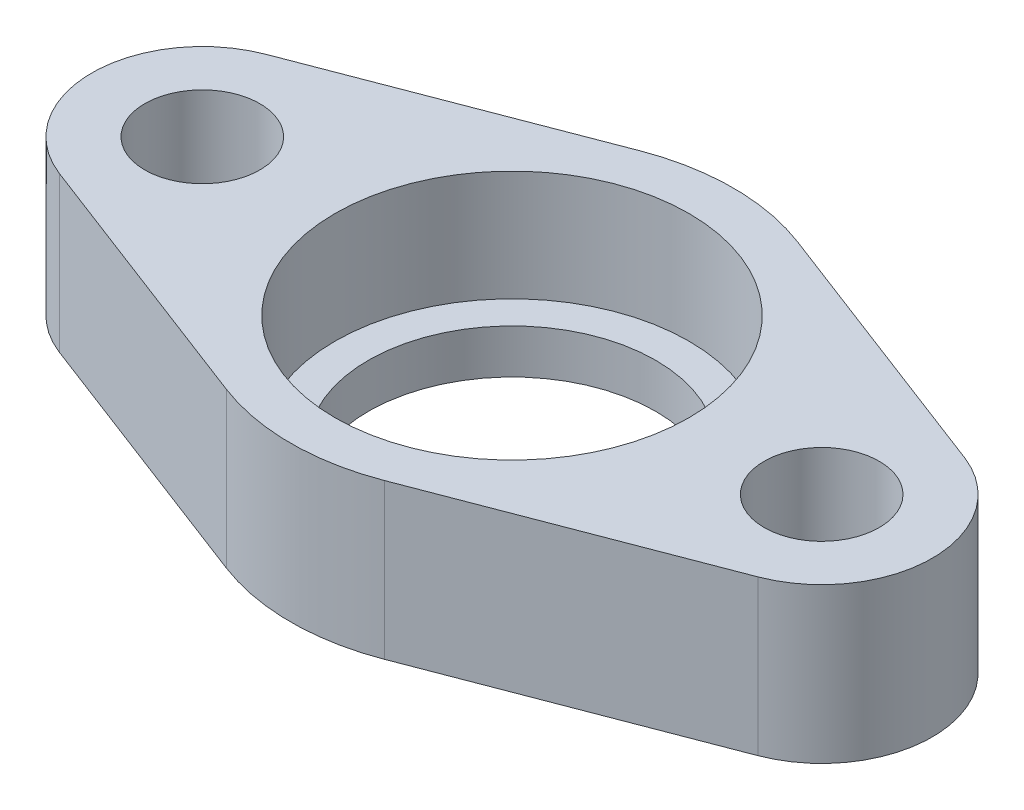
ISO-10303-21;
HEADER;
FILE_DESCRIPTION(('STEP AP214'),'2;1');
FILE_NAME('part.step','',(''),(''),'','','');
FILE_SCHEMA(('AUTOMOTIVE_DESIGN { 1 0 10303 214 1 1 1 1 }'));
ENDSEC;
DATA;
#1=APPLICATION_CONTEXT('core data for automotive mechanical design processes');
#2=APPLICATION_PROTOCOL_DEFINITION('international standard','automotive_design',2000,#1);
#3=PRODUCT_CONTEXT('',#1,'mechanical');
#4=PRODUCT('Part','Part','',(#3));
#5=PRODUCT_RELATED_PRODUCT_CATEGORY('part','',(#4));
#6=PRODUCT_DEFINITION_FORMATION('','',#4);
#7=PRODUCT_DEFINITION_CONTEXT('part definition',#1,'design');
#8=PRODUCT_DEFINITION('design','',#6,#7);
#9=PRODUCT_DEFINITION_SHAPE('','',#8);
#10=(LENGTH_UNIT() NAMED_UNIT(*) SI_UNIT(.MILLI.,.METRE.));
#11=(NAMED_UNIT(*) PLANE_ANGLE_UNIT() SI_UNIT($,.RADIAN.));
#12=(NAMED_UNIT(*) SI_UNIT($,.STERADIAN.) SOLID_ANGLE_UNIT());
#13=UNCERTAINTY_MEASURE_WITH_UNIT(LENGTH_MEASURE(1.E-05),#10,'distance_accuracy_value','');
#14=(GEOMETRIC_REPRESENTATION_CONTEXT(3) GLOBAL_UNCERTAINTY_ASSIGNED_CONTEXT((#13)) GLOBAL_UNIT_ASSIGNED_CONTEXT((#10,
#11,#12)) REPRESENTATION_CONTEXT('',''));
#15=CARTESIAN_POINT('',(0.,0.,0.));
#16=DIRECTION('',(0.,0.,1.));
#17=DIRECTION('',(1.,0.,0.));
#18=AXIS2_PLACEMENT_3D('',#15,#16,#17);
#19=CARTESIAN_POINT('',(0.,3.5,0.));
#20=DIRECTION('',(0.,-1.,0.));
#21=DIRECTION('',(0.,0.,-1.));
#22=AXIS2_PLACEMENT_3D('',#19,#20,#21);
#23=CYLINDRICAL_SURFACE('',#22,4.);
#24=CARTESIAN_POINT('',(0.,3.5,0.));
#25=DIRECTION('',(0.,1.,0.));
#26=DIRECTION('',(0.,0.,1.));
#27=AXIS2_PLACEMENT_3D('',#24,#25,#26);
#28=CIRCLE('',#27,4.);
#29=CARTESIAN_POINT('',(0.,3.5,4.));
#30=VERTEX_POINT('',#29);
#31=EDGE_CURVE('E126',#30,#30,#28,.T.);
#32=ORIENTED_EDGE('',*,*,#31,.T.);
#33=EDGE_LOOP('',(#32));
#34=FACE_BOUND('',#33,.T.);
#35=CARTESIAN_POINT('',(0.,1.,0.));
#36=DIRECTION('',(0.,-1.,0.));
#37=DIRECTION('',(0.,0.,-1.));
#38=AXIS2_PLACEMENT_3D('',#35,#36,#37);
#39=CIRCLE('',#38,4.);
#40=CARTESIAN_POINT('',(0.,1.,-4.));
#41=VERTEX_POINT('',#40);
#42=EDGE_CURVE('E179',#41,#41,#39,.T.);
#43=ORIENTED_EDGE('',*,*,#42,.T.);
#44=EDGE_LOOP('',(#43));
#45=FACE_BOUND('',#44,.T.);
#46=ADVANCED_FACE('F35',(#34,#45),#23,.F.);
#47=CARTESIAN_POINT('',(0.,3.5,0.));
#48=DIRECTION('',(0.,-1.,0.));
#49=DIRECTION('',(0.,0.,-1.));
#50=AXIS2_PLACEMENT_3D('',#47,#48,#49);
#51=CYLINDRICAL_SURFACE('',#50,5.);
#52=DIRECTION('',(0.,-1.,0.));
#53=VECTOR('',#52,1.);
#54=CARTESIAN_POINT('',(1.78571428571429,15.6142520215165,4.67024886807929));
#55=LINE('',#54,#53);
#56=CARTESIAN_POINT('',(1.78571428571429,3.5,4.67024886807929));
#57=VERTEX_POINT('',#56);
#58=CARTESIAN_POINT('',(1.78571428571429,0.,4.67024886807929));
#59=VERTEX_POINT('',#58);
#60=EDGE_CURVE('E103',#57,#59,#55,.T.);
#61=ORIENTED_EDGE('',*,*,#60,.F.);
#62=CARTESIAN_POINT('',(0.,3.5,0.));
#63=DIRECTION('',(0.,1.,0.));
#64=DIRECTION('',(0.,0.,1.));
#65=AXIS2_PLACEMENT_3D('',#62,#63,#64);
#66=CIRCLE('',#65,5.);
#67=CARTESIAN_POINT('',(-1.78571428571429,3.5,4.67024886807929));
#68=VERTEX_POINT('',#67);
#69=EDGE_CURVE('E11',#68,#57,#66,.T.);
#70=ORIENTED_EDGE('',*,*,#69,.F.);
#71=DIRECTION('',(0.,-1.,0.));
#72=VECTOR('',#71,1.);
#73=CARTESIAN_POINT('',(-1.78571428571428,15.6142520215165,4.67024886807929));
#74=LINE('',#73,#72);
#75=CARTESIAN_POINT('',(-1.78571428571428,0.,4.67024886807929));
#76=VERTEX_POINT('',#75);
#77=EDGE_CURVE('E140',#68,#76,#74,.T.);
#78=ORIENTED_EDGE('',*,*,#77,.T.);
#79=CARTESIAN_POINT('',(0.,0.,0.));
#80=DIRECTION('',(0.,1.,0.));
#81=DIRECTION('',(0.,0.,1.));
#82=AXIS2_PLACEMENT_3D('',#79,#80,#81);
#83=CIRCLE('',#82,5.);
#84=EDGE_CURVE('E39',#76,#59,#83,.T.);
#85=ORIENTED_EDGE('',*,*,#84,.T.);
#86=EDGE_LOOP('',(#61,#70,#78,#85));
#87=FACE_BOUND('',#86,.T.);
#88=ADVANCED_FACE('F113',(#87),#51,.T.);
#89=CARTESIAN_POINT('',(0.,3.5,0.));
#90=DIRECTION('',(0.,1.,0.));
#91=DIRECTION('',(0.,0.,1.));
#92=AXIS2_PLACEMENT_3D('',#89,#90,#91);
#93=PLANE('',#92);
#94=CARTESIAN_POINT('',(-7.,3.5,0.));
#95=DIRECTION('',(0.,1.,0.));
#96=DIRECTION('',(0.,0.,1.));
#97=AXIS2_PLACEMENT_3D('',#94,#95,#96);
#98=CIRCLE('',#97,1.29999999999999);
#99=CARTESIAN_POINT('',(-7.,3.5,1.29999999999999));
#100=VERTEX_POINT('',#99);
#101=EDGE_CURVE('E176',#100,#100,#98,.T.);
#102=ORIENTED_EDGE('',*,*,#101,.F.);
#103=EDGE_LOOP('',(#102));
#104=FACE_BOUND('',#103,.T.);
#105=CARTESIAN_POINT('',(7.,3.5,0.));
#106=DIRECTION('',(0.,1.,0.));
#107=DIRECTION('',(0.,0.,1.));
#108=AXIS2_PLACEMENT_3D('',#105,#106,#107);
#109=CIRCLE('',#108,1.29999999999999);
#110=CARTESIAN_POINT('',(7.,3.5,1.29999999999999));
#111=VERTEX_POINT('',#110);
#112=EDGE_CURVE('E170',#111,#111,#109,.T.);
#113=ORIENTED_EDGE('',*,*,#112,.F.);
#114=EDGE_LOOP('',(#113));
#115=FACE_BOUND('',#114,.T.);
#116=ORIENTED_EDGE('',*,*,#69,.T.);
#117=DIRECTION('',(0.934049773615859,0.,-0.357142857142857));
#118=VECTOR('',#117,1.);
#119=CARTESIAN_POINT('',(7.89285714285714,3.5,2.33512443403965));
#120=LINE('',#119,#118);
#121=CARTESIAN_POINT('',(7.89285714285714,3.5,2.33512443403965));
#122=VERTEX_POINT('',#121);
#123=EDGE_CURVE('E99',#57,#122,#120,.T.);
#124=ORIENTED_EDGE('',*,*,#123,.T.);
#125=CARTESIAN_POINT('',(7.,3.5,0.));
#126=DIRECTION('',(0.,1.,0.));
#127=DIRECTION('',(0.,0.,1.));
#128=AXIS2_PLACEMENT_3D('',#125,#126,#127);
#129=CIRCLE('',#128,2.5);
#130=CARTESIAN_POINT('',(7.89285714285714,3.5,-2.33512443403965));
#131=VERTEX_POINT('',#130);
#132=EDGE_CURVE('E107',#122,#131,#129,.T.);
#133=ORIENTED_EDGE('',*,*,#132,.T.);
#134=DIRECTION('',(-0.934049773615859,0.,-0.357142857142857));
#135=VECTOR('',#134,1.);
#136=CARTESIAN_POINT('',(7.89285714285714,3.5,-2.33512443403965));
#137=LINE('',#136,#135);
#138=CARTESIAN_POINT('',(1.78571428571429,3.5,-4.67024886807929));
#139=VERTEX_POINT('',#138);
#140=EDGE_CURVE('E51',#131,#139,#137,.T.);
#141=ORIENTED_EDGE('',*,*,#140,.T.);
#142=CARTESIAN_POINT('',(-1.78571428571429,3.5,-4.67024886807929));
#143=VERTEX_POINT('',#142);
#144=EDGE_CURVE('E44',#139,#143,#66,.T.);
#145=ORIENTED_EDGE('',*,*,#144,.T.);
#146=DIRECTION('',(-0.934049773615859,0.,0.357142857142857));
#147=VECTOR('',#146,1.);
#148=CARTESIAN_POINT('',(-7.89285714285714,3.5,-2.33512443403965));
#149=LINE('',#148,#147);
#150=CARTESIAN_POINT('',(-7.89285714285714,3.5,-2.33512443403965));
#151=VERTEX_POINT('',#150);
#152=EDGE_CURVE('E145',#143,#151,#149,.T.);
#153=ORIENTED_EDGE('',*,*,#152,.T.);
#154=CARTESIAN_POINT('',(-7.,3.5,0.));
#155=DIRECTION('',(0.,1.,0.));
#156=DIRECTION('',(0.,0.,1.));
#157=AXIS2_PLACEMENT_3D('',#154,#155,#156);
#158=CIRCLE('',#157,2.5);
#159=CARTESIAN_POINT('',(-7.89285714285714,3.5,2.33512443403965));
#160=VERTEX_POINT('',#159);
#161=EDGE_CURVE('E130',#151,#160,#158,.T.);
#162=ORIENTED_EDGE('',*,*,#161,.T.);
#163=DIRECTION('',(0.934049773615859,0.,0.357142857142857));
#164=VECTOR('',#163,1.);
#165=CARTESIAN_POINT('',(-7.89285714285714,3.5,2.33512443403965));
#166=LINE('',#165,#164);
#167=EDGE_CURVE('E57',#160,#68,#166,.T.);
#168=ORIENTED_EDGE('',*,*,#167,.T.);
#169=EDGE_LOOP('',(#116,#124,#133,#141,#145,#153,#162,#168));
#170=FACE_BOUND('',#169,.T.);
#171=ORIENTED_EDGE('',*,*,#31,.F.);
#172=EDGE_LOOP('',(#171));
#173=FACE_BOUND('',#172,.T.);
#174=ADVANCED_FACE('F118',(#104,#115,#170,#173),#93,.T.);
#175=CARTESIAN_POINT('',(0.,0.,0.));
#176=DIRECTION('',(0.,1.,0.));
#177=DIRECTION('',(0.,0.,1.));
#178=AXIS2_PLACEMENT_3D('',#175,#176,#177);
#179=PLANE('',#178);
#180=CARTESIAN_POINT('',(-7.,0.,0.));
#181=DIRECTION('',(0.,1.,0.));
#182=DIRECTION('',(0.,0.,1.));
#183=AXIS2_PLACEMENT_3D('',#180,#181,#182);
#184=CIRCLE('',#183,1.3);
#185=CARTESIAN_POINT('',(-7.,0.,1.3));
#186=VERTEX_POINT('',#185);
#187=EDGE_CURVE('E173',#186,#186,#184,.T.);
#188=ORIENTED_EDGE('',*,*,#187,.T.);
#189=EDGE_LOOP('',(#188));
#190=FACE_BOUND('',#189,.T.);
#191=CARTESIAN_POINT('',(7.,0.,0.));
#192=DIRECTION('',(0.,1.,0.));
#193=DIRECTION('',(0.,0.,1.));
#194=AXIS2_PLACEMENT_3D('',#191,#192,#193);
#195=CIRCLE('',#194,1.3);
#196=CARTESIAN_POINT('',(7.,0.,1.3));
#197=VERTEX_POINT('',#196);
#198=EDGE_CURVE('E155',#197,#197,#195,.T.);
#199=ORIENTED_EDGE('',*,*,#198,.T.);
#200=EDGE_LOOP('',(#199));
#201=FACE_BOUND('',#200,.T.);
#202=ORIENTED_EDGE('',*,*,#84,.F.);
#203=DIRECTION('',(0.934049773615859,0.,0.357142857142857));
#204=VECTOR('',#203,1.);
#205=CARTESIAN_POINT('',(-7.89285714285714,0.,2.33512443403965));
#206=LINE('',#205,#204);
#207=CARTESIAN_POINT('',(-7.89285714285714,0.,2.33512443403965));
#208=VERTEX_POINT('',#207);
#209=EDGE_CURVE('E142',#208,#76,#206,.T.);
#210=ORIENTED_EDGE('',*,*,#209,.F.);
#211=CARTESIAN_POINT('',(-7.,0.,0.));
#212=DIRECTION('',(0.,1.,0.));
#213=DIRECTION('',(0.,0.,1.));
#214=AXIS2_PLACEMENT_3D('',#211,#212,#213);
#215=CIRCLE('',#214,2.5);
#216=CARTESIAN_POINT('',(-7.89285714285714,0.,-2.33512443403965));
#217=VERTEX_POINT('',#216);
#218=EDGE_CURVE('E135',#217,#208,#215,.T.);
#219=ORIENTED_EDGE('',*,*,#218,.F.);
#220=DIRECTION('',(-0.934049773615859,0.,0.357142857142857));
#221=VECTOR('',#220,1.);
#222=CARTESIAN_POINT('',(-7.89285714285714,0.,-2.33512443403965));
#223=LINE('',#222,#221);
#224=CARTESIAN_POINT('',(-1.78571428571429,0.,-4.67024886807929));
#225=VERTEX_POINT('',#224);
#226=EDGE_CURVE('E139',#225,#217,#223,.T.);
#227=ORIENTED_EDGE('',*,*,#226,.F.);
#228=CARTESIAN_POINT('',(1.78571428571429,0.,-4.67024886807929));
#229=VERTEX_POINT('',#228);
#230=EDGE_CURVE('E128',#229,#225,#83,.T.);
#231=ORIENTED_EDGE('',*,*,#230,.F.);
#232=DIRECTION('',(-0.934049773615859,0.,-0.357142857142857));
#233=VECTOR('',#232,1.);
#234=CARTESIAN_POINT('',(7.89285714285714,0.,-2.33512443403965));
#235=LINE('',#234,#233);
#236=CARTESIAN_POINT('',(7.89285714285714,0.,-2.33512443403965));
#237=VERTEX_POINT('',#236);
#238=EDGE_CURVE('E159',#237,#229,#235,.T.);
#239=ORIENTED_EDGE('',*,*,#238,.F.);
#240=CARTESIAN_POINT('',(7.,0.,0.));
#241=DIRECTION('',(0.,1.,0.));
#242=DIRECTION('',(0.,0.,-1.));
#243=AXIS2_PLACEMENT_3D('',#240,#241,#242);
#244=CIRCLE('',#243,2.5);
#245=CARTESIAN_POINT('',(7.89285714285714,0.,2.33512443403965));
#246=VERTEX_POINT('',#245);
#247=EDGE_CURVE('E154',#246,#237,#244,.T.);
#248=ORIENTED_EDGE('',*,*,#247,.F.);
#249=DIRECTION('',(0.934049773615859,0.,-0.357142857142857));
#250=VECTOR('',#249,1.);
#251=CARTESIAN_POINT('',(7.89285714285714,0.,2.33512443403965));
#252=LINE('',#251,#250);
#253=EDGE_CURVE('E108',#59,#246,#252,.T.);
#254=ORIENTED_EDGE('',*,*,#253,.F.);
#255=EDGE_LOOP('',(#202,#210,#219,#227,#231,#239,#248,#254));
#256=FACE_BOUND('',#255,.T.);
#257=CARTESIAN_POINT('',(0.,0.,0.));
#258=DIRECTION('',(0.,-1.,0.));
#259=DIRECTION('',(0.,0.,-1.));
#260=AXIS2_PLACEMENT_3D('',#257,#258,#259);
#261=CIRCLE('',#260,3.25);
#262=CARTESIAN_POINT('',(0.,0.,-3.25));
#263=VERTEX_POINT('',#262);
#264=EDGE_CURVE('E183',#263,#263,#261,.T.);
#265=ORIENTED_EDGE('',*,*,#264,.F.);
#266=EDGE_LOOP('',(#265));
#267=FACE_BOUND('',#266,.T.);
#268=ADVANCED_FACE('F121',(#190,#201,#256,#267),#179,.F.);
#269=ORIENTED_EDGE('',*,*,#144,.F.);
#270=DIRECTION('',(0.,-1.,0.));
#271=VECTOR('',#270,1.);
#272=CARTESIAN_POINT('',(1.78571428571429,15.6142520215165,-4.67024886807929));
#273=LINE('',#272,#271);
#274=EDGE_CURVE('E116',#139,#229,#273,.T.);
#275=ORIENTED_EDGE('',*,*,#274,.T.);
#276=ORIENTED_EDGE('',*,*,#230,.T.);
#277=DIRECTION('',(0.,-1.,0.));
#278=VECTOR('',#277,1.);
#279=CARTESIAN_POINT('',(-1.78571428571429,15.6142520215165,-4.67024886807929));
#280=LINE('',#279,#278);
#281=EDGE_CURVE('E136',#143,#225,#280,.T.);
#282=ORIENTED_EDGE('',*,*,#281,.F.);
#283=EDGE_LOOP('',(#269,#275,#276,#282));
#284=FACE_BOUND('',#283,.T.);
#285=ADVANCED_FACE('F37',(#284),#51,.T.);
#286=CARTESIAN_POINT('',(-7.,15.6142520215165,0.));
#287=DIRECTION('',(0.,-1.,0.));
#288=DIRECTION('',(0.,0.,-1.));
#289=AXIS2_PLACEMENT_3D('',#286,#287,#288);
#290=CYLINDRICAL_SURFACE('',#289,2.5);
#291=ORIENTED_EDGE('',*,*,#161,.F.);
#292=DIRECTION('',(0.,-1.,0.));
#293=VECTOR('',#292,1.);
#294=CARTESIAN_POINT('',(-7.89285714285714,15.6142520215165,-2.33512443403965));
#295=LINE('',#294,#293);
#296=EDGE_CURVE('E133',#151,#217,#295,.T.);
#297=ORIENTED_EDGE('',*,*,#296,.T.);
#298=ORIENTED_EDGE('',*,*,#218,.T.);
#299=DIRECTION('',(0.,-1.,0.));
#300=VECTOR('',#299,1.);
#301=CARTESIAN_POINT('',(-7.89285714285714,15.6142520215165,2.33512443403965));
#302=LINE('',#301,#300);
#303=EDGE_CURVE('E143',#160,#208,#302,.T.);
#304=ORIENTED_EDGE('',*,*,#303,.F.);
#305=EDGE_LOOP('',(#291,#297,#298,#304));
#306=FACE_BOUND('',#305,.T.);
#307=ADVANCED_FACE('F203',(#306),#290,.T.);
#308=CARTESIAN_POINT('',(-7.89285714285714,15.6142520215165,2.33512443403965));
#309=DIRECTION('',(0.357142857142857,0.,-0.934049773615859));
#310=DIRECTION('',(-0.934049773615859,0.,-0.357142857142857));
#311=AXIS2_PLACEMENT_3D('',#308,#309,#310);
#312=PLANE('',#311);
#313=ORIENTED_EDGE('',*,*,#167,.F.);
#314=ORIENTED_EDGE('',*,*,#303,.T.);
#315=ORIENTED_EDGE('',*,*,#209,.T.);
#316=ORIENTED_EDGE('',*,*,#77,.F.);
#317=EDGE_LOOP('',(#313,#314,#315,#316));
#318=FACE_BOUND('',#317,.T.);
#319=ADVANCED_FACE('F215',(#318),#312,.F.);
#320=CARTESIAN_POINT('',(-7.89285714285714,15.6142520215165,-2.33512443403965));
#321=DIRECTION('',(0.357142857142857,0.,0.934049773615859));
#322=DIRECTION('',(0.934049773615859,0.,-0.357142857142857));
#323=AXIS2_PLACEMENT_3D('',#320,#321,#322);
#324=PLANE('',#323);
#325=ORIENTED_EDGE('',*,*,#152,.F.);
#326=ORIENTED_EDGE('',*,*,#281,.T.);
#327=ORIENTED_EDGE('',*,*,#226,.T.);
#328=ORIENTED_EDGE('',*,*,#296,.F.);
#329=EDGE_LOOP('',(#325,#326,#327,#328));
#330=FACE_BOUND('',#329,.T.);
#331=ADVANCED_FACE('F219',(#330),#324,.F.);
#332=CARTESIAN_POINT('',(7.,15.6142520215165,0.));
#333=DIRECTION('',(0.,-1.,0.));
#334=DIRECTION('',(0.,0.,-1.));
#335=AXIS2_PLACEMENT_3D('',#332,#333,#334);
#336=CYLINDRICAL_SURFACE('',#335,2.5);
#337=ORIENTED_EDGE('',*,*,#132,.F.);
#338=DIRECTION('',(0.,-1.,0.));
#339=VECTOR('',#338,1.);
#340=CARTESIAN_POINT('',(7.89285714285714,15.6142520215165,2.33512443403965));
#341=LINE('',#340,#339);
#342=EDGE_CURVE('E105',#122,#246,#341,.T.);
#343=ORIENTED_EDGE('',*,*,#342,.T.);
#344=ORIENTED_EDGE('',*,*,#247,.T.);
#345=DIRECTION('',(0.,-1.,0.));
#346=VECTOR('',#345,1.);
#347=CARTESIAN_POINT('',(7.89285714285714,15.6142520215165,-2.33512443403965));
#348=LINE('',#347,#346);
#349=EDGE_CURVE('E160',#131,#237,#348,.T.);
#350=ORIENTED_EDGE('',*,*,#349,.F.);
#351=EDGE_LOOP('',(#337,#343,#344,#350));
#352=FACE_BOUND('',#351,.T.);
#353=ADVANCED_FACE('F223',(#352),#336,.T.);
#354=CARTESIAN_POINT('',(7.89285714285714,15.6142520215165,-2.33512443403965));
#355=DIRECTION('',(-0.357142857142857,0.,0.934049773615859));
#356=DIRECTION('',(0.934049773615859,0.,0.357142857142857));
#357=AXIS2_PLACEMENT_3D('',#354,#355,#356);
#358=PLANE('',#357);
#359=ORIENTED_EDGE('',*,*,#140,.F.);
#360=ORIENTED_EDGE('',*,*,#349,.T.);
#361=ORIENTED_EDGE('',*,*,#238,.T.);
#362=ORIENTED_EDGE('',*,*,#274,.F.);
#363=EDGE_LOOP('',(#359,#360,#361,#362));
#364=FACE_BOUND('',#363,.T.);
#365=ADVANCED_FACE('F227',(#364),#358,.F.);
#366=CARTESIAN_POINT('',(7.89285714285714,15.6142520215165,2.33512443403965));
#367=DIRECTION('',(-0.357142857142857,0.,-0.934049773615859));
#368=DIRECTION('',(-0.934049773615859,0.,0.357142857142857));
#369=AXIS2_PLACEMENT_3D('',#366,#367,#368);
#370=PLANE('',#369);
#371=ORIENTED_EDGE('',*,*,#123,.F.);
#372=ORIENTED_EDGE('',*,*,#60,.T.);
#373=ORIENTED_EDGE('',*,*,#253,.T.);
#374=ORIENTED_EDGE('',*,*,#342,.F.);
#375=EDGE_LOOP('',(#371,#372,#373,#374));
#376=FACE_BOUND('',#375,.T.);
#377=ADVANCED_FACE('F101',(#376),#370,.F.);
#378=CARTESIAN_POINT('',(7.,3.5,0.));
#379=DIRECTION('',(0.,1.,0.));
#380=DIRECTION('',(0.,0.,1.));
#381=AXIS2_PLACEMENT_3D('',#378,#379,#380);
#382=CYLINDRICAL_SURFACE('',#381,1.29999999999999);
#383=ORIENTED_EDGE('',*,*,#198,.F.);
#384=EDGE_LOOP('',(#383));
#385=FACE_BOUND('',#384,.T.);
#386=ORIENTED_EDGE('',*,*,#112,.T.);
#387=EDGE_LOOP('',(#386));
#388=FACE_BOUND('',#387,.T.);
#389=ADVANCED_FACE('F234',(#385,#388),#382,.F.);
#390=CARTESIAN_POINT('',(-7.,3.5,0.));
#391=DIRECTION('',(0.,1.,0.));
#392=DIRECTION('',(0.,0.,1.));
#393=AXIS2_PLACEMENT_3D('',#390,#391,#392);
#394=CYLINDRICAL_SURFACE('',#393,1.29999999999999);
#395=ORIENTED_EDGE('',*,*,#187,.F.);
#396=EDGE_LOOP('',(#395));
#397=FACE_BOUND('',#396,.T.);
#398=ORIENTED_EDGE('',*,*,#101,.T.);
#399=EDGE_LOOP('',(#398));
#400=FACE_BOUND('',#399,.T.);
#401=ADVANCED_FACE('F237',(#397,#400),#394,.F.);
#402=CARTESIAN_POINT('',(0.,1.,0.));
#403=DIRECTION('',(0.,-1.,0.));
#404=DIRECTION('',(0.,0.,-1.));
#405=AXIS2_PLACEMENT_3D('',#402,#403,#404);
#406=PLANE('',#405);
#407=CARTESIAN_POINT('',(0.,1.,0.));
#408=DIRECTION('',(0.,-1.,0.));
#409=DIRECTION('',(0.,0.,-1.));
#410=AXIS2_PLACEMENT_3D('',#407,#408,#409);
#411=CIRCLE('',#410,3.25);
#412=CARTESIAN_POINT('',(0.,1.,-3.25));
#413=VERTEX_POINT('',#412);
#414=EDGE_CURVE('E182',#413,#413,#411,.T.);
#415=ORIENTED_EDGE('',*,*,#414,.T.);
#416=EDGE_LOOP('',(#415));
#417=FACE_BOUND('',#416,.T.);
#418=ORIENTED_EDGE('',*,*,#42,.F.);
#419=EDGE_LOOP('',(#418));
#420=FACE_BOUND('',#419,.T.);
#421=ADVANCED_FACE('F189',(#417,#420),#406,.F.);
#422=CARTESIAN_POINT('',(0.,1.,0.));
#423=DIRECTION('',(0.,-1.,0.));
#424=DIRECTION('',(0.,0.,-1.));
#425=AXIS2_PLACEMENT_3D('',#422,#423,#424);
#426=CYLINDRICAL_SURFACE('',#425,3.25);
#427=ORIENTED_EDGE('',*,*,#414,.F.);
#428=EDGE_LOOP('',(#427));
#429=FACE_BOUND('',#428,.T.);
#430=ORIENTED_EDGE('',*,*,#264,.T.);
#431=EDGE_LOOP('',(#430));
#432=FACE_BOUND('',#431,.T.);
#433=ADVANCED_FACE('F192',(#429,#432),#426,.F.);
#434=CLOSED_SHELL('',(#46,#88,#174,#268,#285,#307,#319,#331,#353,#365,#377,#389,#401,#421,#433));
#435=MANIFOLD_SOLID_BREP('B2',#434);
#436=ADVANCED_BREP_SHAPE_REPRESENTATION('',(#18,#435),#14);
#437=SHAPE_DEFINITION_REPRESENTATION(#9,#436);
ENDSEC;
END-ISO-10303-21;
